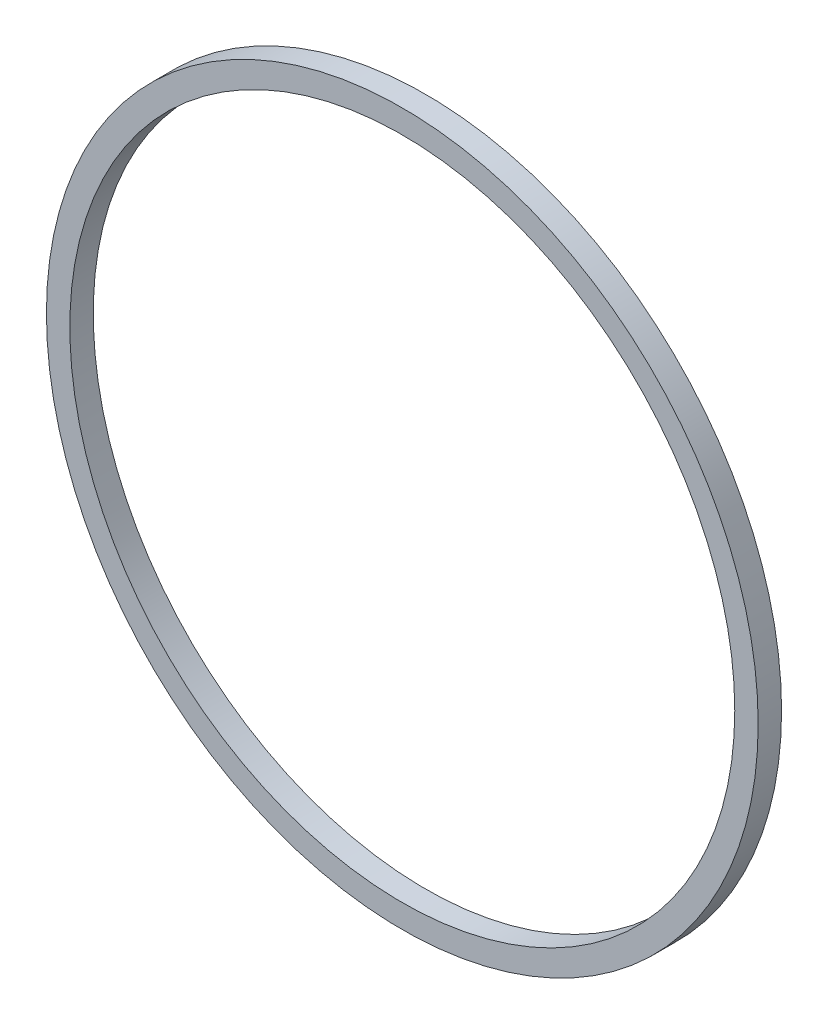
ISO-10303-21;
HEADER;
FILE_DESCRIPTION(('STEP AP214'),'2;1');
FILE_NAME('part.step','',(''),(''),'','','');
FILE_SCHEMA(('AUTOMOTIVE_DESIGN { 1 0 10303 214 1 1 1 1 }'));
ENDSEC;
DATA;
#1=APPLICATION_CONTEXT('core data for automotive mechanical design processes');
#2=APPLICATION_PROTOCOL_DEFINITION('international standard','automotive_design',2000,#1);
#3=PRODUCT_CONTEXT('',#1,'mechanical');
#4=PRODUCT('Part','Part','',(#3));
#5=PRODUCT_RELATED_PRODUCT_CATEGORY('part','',(#4));
#6=PRODUCT_DEFINITION_FORMATION('','',#4);
#7=PRODUCT_DEFINITION_CONTEXT('part definition',#1,'design');
#8=PRODUCT_DEFINITION('design','',#6,#7);
#9=PRODUCT_DEFINITION_SHAPE('','',#8);
#10=(LENGTH_UNIT() NAMED_UNIT(*) SI_UNIT(.MILLI.,.METRE.));
#11=(NAMED_UNIT(*) PLANE_ANGLE_UNIT() SI_UNIT($,.RADIAN.));
#12=(NAMED_UNIT(*) SI_UNIT($,.STERADIAN.) SOLID_ANGLE_UNIT());
#13=UNCERTAINTY_MEASURE_WITH_UNIT(LENGTH_MEASURE(1.E-05),#10,'distance_accuracy_value','');
#14=(GEOMETRIC_REPRESENTATION_CONTEXT(3) GLOBAL_UNCERTAINTY_ASSIGNED_CONTEXT((#13)) GLOBAL_UNIT_ASSIGNED_CONTEXT((#10,
#11,#12)) REPRESENTATION_CONTEXT('',''));
#15=CARTESIAN_POINT('',(0.,0.,0.));
#16=DIRECTION('',(0.,0.,1.));
#17=DIRECTION('',(1.,0.,0.));
#18=AXIS2_PLACEMENT_3D('',#15,#16,#17);
#19=CARTESIAN_POINT('',(0.,0.,0.889000000000001));
#20=DIRECTION('',(0.,0.,1.));
#21=DIRECTION('',(1.,0.,0.));
#22=AXIS2_PLACEMENT_3D('',#19,#20,#21);
#23=CYLINDRICAL_SURFACE('',#22,25.2603);
#24=CARTESIAN_POINT('',(0.,0.,-0.889000000000002));
#25=DIRECTION('',(0.,0.,1.));
#26=DIRECTION('',(1.,0.,0.));
#27=AXIS2_PLACEMENT_3D('',#24,#25,#26);
#28=CIRCLE('',#27,25.2603);
#29=CARTESIAN_POINT('',(25.2603,0.,-0.889000000000007));
#30=VERTEX_POINT('',#29);
#31=EDGE_CURVE('E54',#30,#30,#28,.T.);
#32=ORIENTED_EDGE('',*,*,#31,.F.);
#33=EDGE_LOOP('',(#32));
#34=FACE_BOUND('',#33,.T.);
#35=CARTESIAN_POINT('',(0.,0.,0.888999999999993));
#36=DIRECTION('',(0.,0.,1.));
#37=DIRECTION('',(1.,0.,0.));
#38=AXIS2_PLACEMENT_3D('',#35,#36,#37);
#39=CIRCLE('',#38,25.2603);
#40=CARTESIAN_POINT('',(25.2603,0.,0.888999999999988));
#41=VERTEX_POINT('',#40);
#42=EDGE_CURVE('E10',#41,#41,#39,.T.);
#43=ORIENTED_EDGE('',*,*,#42,.T.);
#44=EDGE_LOOP('',(#43));
#45=FACE_BOUND('',#44,.T.);
#46=ADVANCED_FACE('F36',(#34,#45),#23,.F.);
#47=CARTESIAN_POINT('',(-27.0383,0.,0.888999999999999));
#48=DIRECTION('',(0.,0.,-1.));
#49=DIRECTION('',(-1.,0.,0.));
#50=AXIS2_PLACEMENT_3D('',#47,#48,#49);
#51=PLANE('',#50);
#52=ORIENTED_EDGE('',*,*,#42,.F.);
#53=EDGE_LOOP('',(#52));
#54=FACE_BOUND('',#53,.T.);
#55=CARTESIAN_POINT('',(0.,0.,0.888999999999996));
#56=DIRECTION('',(0.,0.,1.));
#57=DIRECTION('',(1.,0.,0.));
#58=AXIS2_PLACEMENT_3D('',#55,#56,#57);
#59=CIRCLE('',#58,27.0383);
#60=CARTESIAN_POINT('',(27.0383,0.,0.888999999999991));
#61=VERTEX_POINT('',#60);
#62=EDGE_CURVE('E43',#61,#61,#59,.T.);
#63=ORIENTED_EDGE('',*,*,#62,.T.);
#64=EDGE_LOOP('',(#63));
#65=FACE_BOUND('',#64,.T.);
#66=ADVANCED_FACE('F63',(#54,#65),#51,.F.);
#67=CARTESIAN_POINT('',(0.,0.,0.889000000000001));
#68=DIRECTION('',(0.,0.,1.));
#69=DIRECTION('',(1.,0.,0.));
#70=AXIS2_PLACEMENT_3D('',#67,#68,#69);
#71=CYLINDRICAL_SURFACE('',#70,27.0383);
#72=ORIENTED_EDGE('',*,*,#62,.F.);
#73=EDGE_LOOP('',(#72));
#74=FACE_BOUND('',#73,.T.);
#75=CARTESIAN_POINT('',(0.,0.,-0.889000000000006));
#76=DIRECTION('',(0.,0.,1.));
#77=DIRECTION('',(1.,0.,0.));
#78=AXIS2_PLACEMENT_3D('',#75,#76,#77);
#79=CIRCLE('',#78,27.0383);
#80=CARTESIAN_POINT('',(27.0383,0.,-0.889000000000011));
#81=VERTEX_POINT('',#80);
#82=EDGE_CURVE('E49',#81,#81,#79,.T.);
#83=ORIENTED_EDGE('',*,*,#82,.T.);
#84=EDGE_LOOP('',(#83));
#85=FACE_BOUND('',#84,.T.);
#86=ADVANCED_FACE('F67',(#74,#85),#71,.T.);
#87=CARTESIAN_POINT('',(-27.0383,0.,-0.888999999999999));
#88=DIRECTION('',(0.,0.,1.));
#89=DIRECTION('',(1.,0.,0.));
#90=AXIS2_PLACEMENT_3D('',#87,#88,#89);
#91=PLANE('',#90);
#92=ORIENTED_EDGE('',*,*,#82,.F.);
#93=EDGE_LOOP('',(#92));
#94=FACE_BOUND('',#93,.T.);
#95=ORIENTED_EDGE('',*,*,#31,.T.);
#96=EDGE_LOOP('',(#95));
#97=FACE_BOUND('',#96,.T.);
#98=ADVANCED_FACE('F60',(#94,#97),#91,.F.);
#99=CLOSED_SHELL('',(#46,#66,#86,#98));
#100=MANIFOLD_SOLID_BREP('B2',#99);
#101=ADVANCED_BREP_SHAPE_REPRESENTATION('',(#18,#100),#14);
#102=SHAPE_DEFINITION_REPRESENTATION(#9,#101);
ENDSEC;
END-ISO-10303-21;
